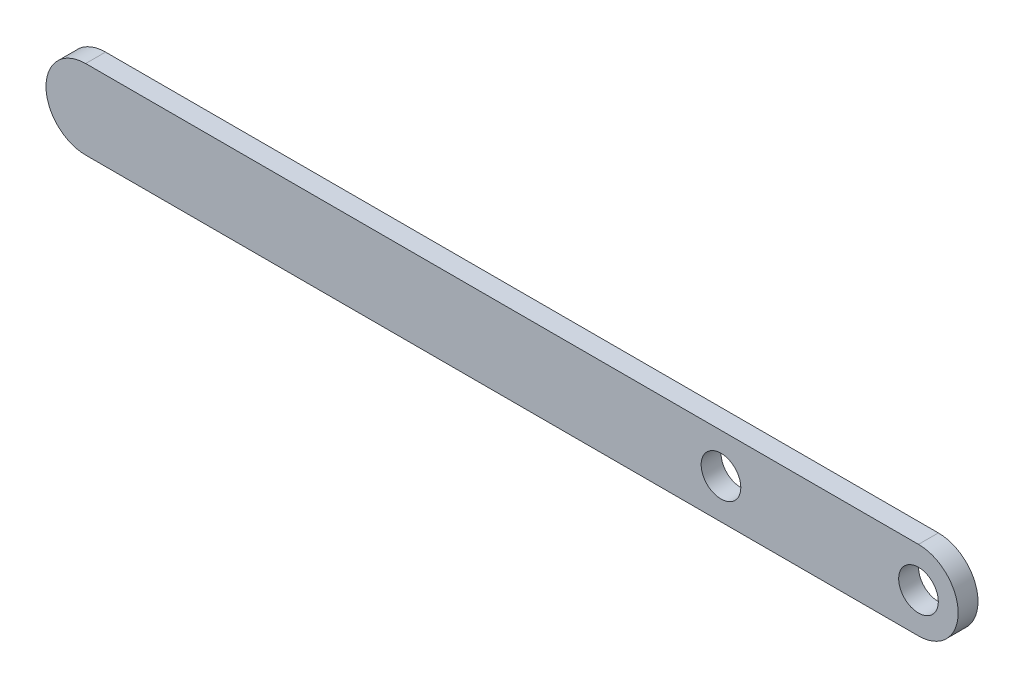
ISO-10303-21;
HEADER;
FILE_DESCRIPTION(('STEP AP214'),'2;1');
FILE_NAME('part.step','',(''),(''),'','','');
FILE_SCHEMA(('AUTOMOTIVE_DESIGN { 1 0 10303 214 1 1 1 1 }'));
ENDSEC;
DATA;
#1=APPLICATION_CONTEXT('core data for automotive mechanical design processes');
#2=APPLICATION_PROTOCOL_DEFINITION('international standard','automotive_design',2000,#1);
#3=PRODUCT_CONTEXT('',#1,'mechanical');
#4=PRODUCT('Part','Part','',(#3));
#5=PRODUCT_RELATED_PRODUCT_CATEGORY('part','',(#4));
#6=PRODUCT_DEFINITION_FORMATION('','',#4);
#7=PRODUCT_DEFINITION_CONTEXT('part definition',#1,'design');
#8=PRODUCT_DEFINITION('design','',#6,#7);
#9=PRODUCT_DEFINITION_SHAPE('','',#8);
#10=(LENGTH_UNIT() NAMED_UNIT(*) SI_UNIT(.MILLI.,.METRE.));
#11=(NAMED_UNIT(*) PLANE_ANGLE_UNIT() SI_UNIT($,.RADIAN.));
#12=(NAMED_UNIT(*) SI_UNIT($,.STERADIAN.) SOLID_ANGLE_UNIT());
#13=UNCERTAINTY_MEASURE_WITH_UNIT(LENGTH_MEASURE(1.E-05),#10,'distance_accuracy_value','');
#14=(GEOMETRIC_REPRESENTATION_CONTEXT(3) GLOBAL_UNCERTAINTY_ASSIGNED_CONTEXT((#13)) GLOBAL_UNIT_ASSIGNED_CONTEXT((#10,
#11,#12)) REPRESENTATION_CONTEXT('',''));
#15=CARTESIAN_POINT('',(0.,0.,0.));
#16=DIRECTION('',(0.,0.,1.));
#17=DIRECTION('',(1.,0.,0.));
#18=AXIS2_PLACEMENT_3D('',#15,#16,#17);
#19=CARTESIAN_POINT('',(-54.3873517786561,0.,2.5));
#20=DIRECTION('',(0.,0.,1.));
#21=DIRECTION('',(1.,0.,0.));
#22=AXIS2_PLACEMENT_3D('',#19,#20,#21);
#23=PLANE('',#22);
#24=CARTESIAN_POINT('',(50.4828077503871,0.,2.5));
#25=DIRECTION('',(0.,0.,1.));
#26=DIRECTION('',(1.,0.,0.));
#27=AXIS2_PLACEMENT_3D('',#24,#25,#26);
#28=CIRCLE('',#27,2.49690856021532);
#29=CARTESIAN_POINT('',(52.9797163106024,0.,2.5));
#30=VERTEX_POINT('',#29);
#31=EDGE_CURVE('E104',#30,#30,#28,.T.);
#32=ORIENTED_EDGE('',*,*,#31,.F.);
#33=EDGE_LOOP('',(#32));
#34=FACE_BOUND('',#33,.T.);
#35=CARTESIAN_POINT('',(-54.3873517786561,0.,2.5));
#36=DIRECTION('',(0.,0.,1.));
#37=DIRECTION('',(1.,0.,0.));
#38=AXIS2_PLACEMENT_3D('',#35,#36,#37);
#39=CIRCLE('',#38,4.99381712043063);
#40=CARTESIAN_POINT('',(-54.3873517786561,4.99381712043063,2.5));
#41=VERTEX_POINT('',#40);
#42=CARTESIAN_POINT('',(-54.3873517786561,-4.99381712043063,2.5));
#43=VERTEX_POINT('',#42);
#44=EDGE_CURVE('E89',#41,#43,#39,.T.);
#45=ORIENTED_EDGE('',*,*,#44,.T.);
#46=DIRECTION('',(1.,0.,0.));
#47=VECTOR('',#46,1.);
#48=CARTESIAN_POINT('',(-54.3873517786561,-4.99381712043063,2.5));
#49=LINE('',#48,#47);
#50=CARTESIAN_POINT('',(50.4828077503871,-4.99381712043063,2.5));
#51=VERTEX_POINT('',#50);
#52=EDGE_CURVE('E84',#43,#51,#49,.T.);
#53=ORIENTED_EDGE('',*,*,#52,.T.);
#54=CARTESIAN_POINT('',(50.4828077503871,0.,2.5));
#55=DIRECTION('',(0.,0.,1.));
#56=DIRECTION('',(1.,0.,0.));
#57=AXIS2_PLACEMENT_3D('',#54,#55,#56);
#58=CIRCLE('',#57,4.99381712043063);
#59=CARTESIAN_POINT('',(50.4828077503871,4.99381712043063,2.5));
#60=VERTEX_POINT('',#59);
#61=EDGE_CURVE('E87',#51,#60,#58,.T.);
#62=ORIENTED_EDGE('',*,*,#61,.T.);
#63=DIRECTION('',(-1.,0.,0.));
#64=VECTOR('',#63,1.);
#65=CARTESIAN_POINT('',(-54.3873517786561,4.99381712043063,2.5));
#66=LINE('',#65,#64);
#67=EDGE_CURVE('E54',#60,#41,#66,.T.);
#68=ORIENTED_EDGE('',*,*,#67,.T.);
#69=EDGE_LOOP('',(#45,#53,#62,#68));
#70=FACE_BOUND('',#69,.T.);
#71=CARTESIAN_POINT('',(25.6126482213439,0.,2.5));
#72=DIRECTION('',(0.,0.,1.));
#73=DIRECTION('',(1.,0.,0.));
#74=AXIS2_PLACEMENT_3D('',#71,#72,#73);
#75=CIRCLE('',#74,2.49690856021531);
#76=CARTESIAN_POINT('',(28.1095567815592,0.,2.5));
#77=VERTEX_POINT('',#76);
#78=EDGE_CURVE('E119',#77,#77,#75,.T.);
#79=ORIENTED_EDGE('',*,*,#78,.F.);
#80=EDGE_LOOP('',(#79));
#81=FACE_BOUND('',#80,.T.);
#82=ADVANCED_FACE('F37',(#34,#70,#81),#23,.T.);
#83=CARTESIAN_POINT('',(-54.3873517786561,0.,0.));
#84=DIRECTION('',(0.,0.,1.));
#85=DIRECTION('',(1.,0.,0.));
#86=AXIS2_PLACEMENT_3D('',#83,#84,#85);
#87=PLANE('',#86);
#88=CARTESIAN_POINT('',(-54.3873517786561,0.,0.));
#89=DIRECTION('',(0.,0.,1.));
#90=DIRECTION('',(1.,0.,0.));
#91=AXIS2_PLACEMENT_3D('',#88,#89,#90);
#92=CIRCLE('',#91,4.99381712043063);
#93=CARTESIAN_POINT('',(-54.3873517786561,4.99381712043063,0.));
#94=VERTEX_POINT('',#93);
#95=CARTESIAN_POINT('',(-54.3873517786561,-4.99381712043063,0.));
#96=VERTEX_POINT('',#95);
#97=EDGE_CURVE('E101',#94,#96,#92,.T.);
#98=ORIENTED_EDGE('',*,*,#97,.F.);
#99=DIRECTION('',(-1.,0.,0.));
#100=VECTOR('',#99,1.);
#101=CARTESIAN_POINT('',(-54.3873517786561,4.99381712043063,0.));
#102=LINE('',#101,#100);
#103=CARTESIAN_POINT('',(50.4828077503871,4.99381712043063,0.));
#104=VERTEX_POINT('',#103);
#105=EDGE_CURVE('E77',#104,#94,#102,.T.);
#106=ORIENTED_EDGE('',*,*,#105,.F.);
#107=CARTESIAN_POINT('',(50.4828077503871,0.,0.));
#108=DIRECTION('',(0.,0.,1.));
#109=DIRECTION('',(1.,0.,0.));
#110=AXIS2_PLACEMENT_3D('',#107,#108,#109);
#111=CIRCLE('',#110,4.99381712043063);
#112=CARTESIAN_POINT('',(50.4828077503871,-4.99381712043063,0.));
#113=VERTEX_POINT('',#112);
#114=EDGE_CURVE('E71',#113,#104,#111,.T.);
#115=ORIENTED_EDGE('',*,*,#114,.F.);
#116=DIRECTION('',(1.,0.,0.));
#117=VECTOR('',#116,1.);
#118=CARTESIAN_POINT('',(-54.3873517786561,-4.99381712043063,0.));
#119=LINE('',#118,#117);
#120=EDGE_CURVE('E93',#96,#113,#119,.T.);
#121=ORIENTED_EDGE('',*,*,#120,.F.);
#122=EDGE_LOOP('',(#98,#106,#115,#121));
#123=FACE_BOUND('',#122,.T.);
#124=CARTESIAN_POINT('',(50.4828077503871,0.,0.));
#125=DIRECTION('',(0.,0.,1.));
#126=DIRECTION('',(1.,0.,0.));
#127=AXIS2_PLACEMENT_3D('',#124,#125,#126);
#128=CIRCLE('',#127,2.49690856021532);
#129=CARTESIAN_POINT('',(52.9797163106024,0.,0.));
#130=VERTEX_POINT('',#129);
#131=EDGE_CURVE('E116',#130,#130,#128,.T.);
#132=ORIENTED_EDGE('',*,*,#131,.T.);
#133=EDGE_LOOP('',(#132));
#134=FACE_BOUND('',#133,.T.);
#135=CARTESIAN_POINT('',(25.6126482213439,0.,0.));
#136=DIRECTION('',(0.,0.,1.));
#137=DIRECTION('',(1.,0.,0.));
#138=AXIS2_PLACEMENT_3D('',#135,#136,#137);
#139=CIRCLE('',#138,2.49690856021531);
#140=CARTESIAN_POINT('',(28.1095567815592,0.,0.));
#141=VERTEX_POINT('',#140);
#142=EDGE_CURVE('E122',#141,#141,#139,.T.);
#143=ORIENTED_EDGE('',*,*,#142,.T.);
#144=EDGE_LOOP('',(#143));
#145=FACE_BOUND('',#144,.T.);
#146=ADVANCED_FACE('F112',(#123,#134,#145),#87,.F.);
#147=CARTESIAN_POINT('',(-54.3873517786561,0.,2.5));
#148=DIRECTION('',(0.,0.,-1.));
#149=DIRECTION('',(-1.,0.,0.));
#150=AXIS2_PLACEMENT_3D('',#147,#148,#149);
#151=CYLINDRICAL_SURFACE('',#150,4.99381712043063);
#152=ORIENTED_EDGE('',*,*,#97,.T.);
#153=DIRECTION('',(0.,0.,-1.));
#154=VECTOR('',#153,1.);
#155=CARTESIAN_POINT('',(-54.3873517786561,-4.99381712043063,2.5));
#156=LINE('',#155,#154);
#157=EDGE_CURVE('E11',#43,#96,#156,.T.);
#158=ORIENTED_EDGE('',*,*,#157,.F.);
#159=ORIENTED_EDGE('',*,*,#44,.F.);
#160=DIRECTION('',(0.,0.,-1.));
#161=VECTOR('',#160,1.);
#162=CARTESIAN_POINT('',(-54.3873517786561,4.99381712043063,2.5));
#163=LINE('',#162,#161);
#164=EDGE_CURVE('E97',#41,#94,#163,.T.);
#165=ORIENTED_EDGE('',*,*,#164,.T.);
#166=EDGE_LOOP('',(#152,#158,#159,#165));
#167=FACE_BOUND('',#166,.T.);
#168=ADVANCED_FACE('F39',(#167),#151,.T.);
#169=CARTESIAN_POINT('',(-54.3873517786561,-4.99381712043063,2.5));
#170=DIRECTION('',(0.,1.,0.));
#171=DIRECTION('',(0.,0.,1.));
#172=AXIS2_PLACEMENT_3D('',#169,#170,#171);
#173=PLANE('',#172);
#174=ORIENTED_EDGE('',*,*,#120,.T.);
#175=DIRECTION('',(0.,0.,-1.));
#176=VECTOR('',#175,1.);
#177=CARTESIAN_POINT('',(50.4828077503871,-4.99381712043063,2.5));
#178=LINE('',#177,#176);
#179=EDGE_CURVE('E46',#51,#113,#178,.T.);
#180=ORIENTED_EDGE('',*,*,#179,.F.);
#181=ORIENTED_EDGE('',*,*,#52,.F.);
#182=ORIENTED_EDGE('',*,*,#157,.T.);
#183=EDGE_LOOP('',(#174,#180,#181,#182));
#184=FACE_BOUND('',#183,.T.);
#185=ADVANCED_FACE('F92',(#184),#173,.F.);
#186=CARTESIAN_POINT('',(50.4828077503871,0.,2.5));
#187=DIRECTION('',(0.,0.,-1.));
#188=DIRECTION('',(-1.,0.,0.));
#189=AXIS2_PLACEMENT_3D('',#186,#187,#188);
#190=CYLINDRICAL_SURFACE('',#189,4.99381712043063);
#191=ORIENTED_EDGE('',*,*,#114,.T.);
#192=DIRECTION('',(0.,0.,-1.));
#193=VECTOR('',#192,1.);
#194=CARTESIAN_POINT('',(50.4828077503871,4.99381712043063,2.5));
#195=LINE('',#194,#193);
#196=EDGE_CURVE('E94',#60,#104,#195,.T.);
#197=ORIENTED_EDGE('',*,*,#196,.F.);
#198=ORIENTED_EDGE('',*,*,#61,.F.);
#199=ORIENTED_EDGE('',*,*,#179,.T.);
#200=EDGE_LOOP('',(#191,#197,#198,#199));
#201=FACE_BOUND('',#200,.T.);
#202=ADVANCED_FACE('F95',(#201),#190,.T.);
#203=CARTESIAN_POINT('',(-54.3873517786561,4.99381712043063,2.5));
#204=DIRECTION('',(0.,-1.,0.));
#205=DIRECTION('',(0.,0.,-1.));
#206=AXIS2_PLACEMENT_3D('',#203,#204,#205);
#207=PLANE('',#206);
#208=ORIENTED_EDGE('',*,*,#105,.T.);
#209=ORIENTED_EDGE('',*,*,#164,.F.);
#210=ORIENTED_EDGE('',*,*,#67,.F.);
#211=ORIENTED_EDGE('',*,*,#196,.T.);
#212=EDGE_LOOP('',(#208,#209,#210,#211));
#213=FACE_BOUND('',#212,.T.);
#214=ADVANCED_FACE('F109',(#213),#207,.F.);
#215=CARTESIAN_POINT('',(50.4828077503871,0.,2.5));
#216=DIRECTION('',(0.,0.,-1.));
#217=DIRECTION('',(-1.,0.,0.));
#218=AXIS2_PLACEMENT_3D('',#215,#216,#217);
#219=CYLINDRICAL_SURFACE('',#218,2.49690856021532);
#220=ORIENTED_EDGE('',*,*,#31,.T.);
#221=EDGE_LOOP('',(#220));
#222=FACE_BOUND('',#221,.T.);
#223=ORIENTED_EDGE('',*,*,#131,.F.);
#224=EDGE_LOOP('',(#223));
#225=FACE_BOUND('',#224,.T.);
#226=ADVANCED_FACE('F139',(#222,#225),#219,.F.);
#227=CARTESIAN_POINT('',(25.6126482213439,0.,2.5));
#228=DIRECTION('',(0.,0.,-1.));
#229=DIRECTION('',(-1.,0.,0.));
#230=AXIS2_PLACEMENT_3D('',#227,#228,#229);
#231=CYLINDRICAL_SURFACE('',#230,2.49690856021531);
#232=ORIENTED_EDGE('',*,*,#78,.T.);
#233=EDGE_LOOP('',(#232));
#234=FACE_BOUND('',#233,.T.);
#235=ORIENTED_EDGE('',*,*,#142,.F.);
#236=EDGE_LOOP('',(#235));
#237=FACE_BOUND('',#236,.T.);
#238=ADVANCED_FACE('F128',(#234,#237),#231,.F.);
#239=CLOSED_SHELL('',(#82,#146,#168,#185,#202,#214,#226,#238));
#240=MANIFOLD_SOLID_BREP('B2',#239);
#241=ADVANCED_BREP_SHAPE_REPRESENTATION('',(#18,#240),#14);
#242=SHAPE_DEFINITION_REPRESENTATION(#9,#241);
ENDSEC;
END-ISO-10303-21;
